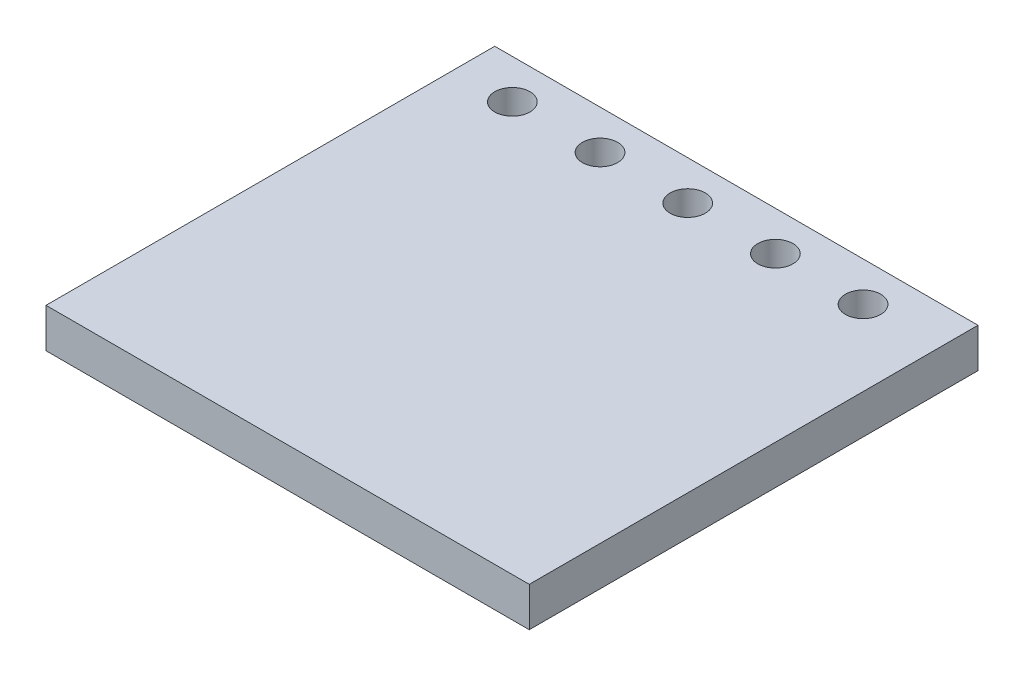
ISO-10303-21;
HEADER;
FILE_DESCRIPTION(('STEP AP214'),'2;1');
FILE_NAME('part.step','',(''),(''),'','','');
FILE_SCHEMA(('AUTOMOTIVE_DESIGN { 1 0 10303 214 1 1 1 1 }'));
ENDSEC;
DATA;
#1=APPLICATION_CONTEXT('core data for automotive mechanical design processes');
#2=APPLICATION_PROTOCOL_DEFINITION('international standard','automotive_design',2000,#1);
#3=PRODUCT_CONTEXT('',#1,'mechanical');
#4=PRODUCT('Part','Part','',(#3));
#5=PRODUCT_RELATED_PRODUCT_CATEGORY('part','',(#4));
#6=PRODUCT_DEFINITION_FORMATION('','',#4);
#7=PRODUCT_DEFINITION_CONTEXT('part definition',#1,'design');
#8=PRODUCT_DEFINITION('design','',#6,#7);
#9=PRODUCT_DEFINITION_SHAPE('','',#8);
#10=(LENGTH_UNIT() NAMED_UNIT(*) SI_UNIT(.MILLI.,.METRE.));
#11=(NAMED_UNIT(*) PLANE_ANGLE_UNIT() SI_UNIT($,.RADIAN.));
#12=(NAMED_UNIT(*) SI_UNIT($,.STERADIAN.) SOLID_ANGLE_UNIT());
#13=UNCERTAINTY_MEASURE_WITH_UNIT(LENGTH_MEASURE(1.E-05),#10,'distance_accuracy_value','');
#14=(GEOMETRIC_REPRESENTATION_CONTEXT(3) GLOBAL_UNCERTAINTY_ASSIGNED_CONTEXT((#13)) GLOBAL_UNIT_ASSIGNED_CONTEXT((#10,
#11,#12)) REPRESENTATION_CONTEXT('',''));
#15=CARTESIAN_POINT('',(0.,0.,0.));
#16=DIRECTION('',(0.,0.,1.));
#17=DIRECTION('',(1.,0.,0.));
#18=AXIS2_PLACEMENT_3D('',#15,#16,#17);
#19=CARTESIAN_POINT('',(0.,1.14,0.));
#20=DIRECTION('',(0.,1.,0.));
#21=DIRECTION('',(0.,0.,1.));
#22=AXIS2_PLACEMENT_3D('',#19,#20,#21);
#23=PLANE('',#22);
#24=CARTESIAN_POINT('',(9.27,1.14,1.14));
#25=DIRECTION('',(0.,1.,0.));
#26=DIRECTION('',(0.,0.,1.));
#27=AXIS2_PLACEMENT_3D('',#24,#25,#26);
#28=CIRCLE('',#27,0.509999999999999);
#29=CARTESIAN_POINT('',(9.27,1.14,1.65));
#30=VERTEX_POINT('',#29);
#31=EDGE_CURVE('E127',#30,#30,#28,.T.);
#32=ORIENTED_EDGE('',*,*,#31,.F.);
#33=EDGE_LOOP('',(#32));
#34=FACE_BOUND('',#33,.T.);
#35=CARTESIAN_POINT('',(4.19,1.14,1.14));
#36=DIRECTION('',(0.,1.,0.));
#37=DIRECTION('',(0.,0.,1.));
#38=AXIS2_PLACEMENT_3D('',#35,#36,#37);
#39=CIRCLE('',#38,0.51);
#40=CARTESIAN_POINT('',(4.19,1.14,1.65));
#41=VERTEX_POINT('',#40);
#42=EDGE_CURVE('E115',#41,#41,#39,.T.);
#43=ORIENTED_EDGE('',*,*,#42,.F.);
#44=EDGE_LOOP('',(#43));
#45=FACE_BOUND('',#44,.T.);
#46=DIRECTION('',(0.,0.,1.));
#47=VECTOR('',#46,1.);
#48=CARTESIAN_POINT('',(0.,1.14,0.));
#49=LINE('',#48,#47);
#50=CARTESIAN_POINT('',(0.,1.14,0.));
#51=VERTEX_POINT('',#50);
#52=CARTESIAN_POINT('',(0.,1.14,13.));
#53=VERTEX_POINT('',#52);
#54=EDGE_CURVE('E85',#51,#53,#49,.T.);
#55=ORIENTED_EDGE('',*,*,#54,.T.);
#56=DIRECTION('',(1.,0.,0.));
#57=VECTOR('',#56,1.);
#58=CARTESIAN_POINT('',(0.,1.14,13.));
#59=LINE('',#58,#57);
#60=CARTESIAN_POINT('',(14.,1.14,13.));
#61=VERTEX_POINT('',#60);
#62=EDGE_CURVE('E80',#53,#61,#59,.T.);
#63=ORIENTED_EDGE('',*,*,#62,.T.);
#64=DIRECTION('',(0.,0.,-1.));
#65=VECTOR('',#64,1.);
#66=CARTESIAN_POINT('',(14.,1.14,0.));
#67=LINE('',#66,#65);
#68=CARTESIAN_POINT('',(14.,1.14,0.));
#69=VERTEX_POINT('',#68);
#70=EDGE_CURVE('E83',#61,#69,#67,.T.);
#71=ORIENTED_EDGE('',*,*,#70,.T.);
#72=DIRECTION('',(-1.,0.,0.));
#73=VECTOR('',#72,1.);
#74=CARTESIAN_POINT('',(0.,1.14,0.));
#75=LINE('',#74,#73);
#76=EDGE_CURVE('E50',#69,#51,#75,.T.);
#77=ORIENTED_EDGE('',*,*,#76,.T.);
#78=EDGE_LOOP('',(#55,#63,#71,#77));
#79=FACE_BOUND('',#78,.T.);
#80=CARTESIAN_POINT('',(1.65,1.14,1.14));
#81=DIRECTION('',(0.,1.,0.));
#82=DIRECTION('',(0.,0.,1.));
#83=AXIS2_PLACEMENT_3D('',#80,#81,#82);
#84=CIRCLE('',#83,0.51);
#85=CARTESIAN_POINT('',(1.65,1.14,1.65));
#86=VERTEX_POINT('',#85);
#87=EDGE_CURVE('E100',#86,#86,#84,.T.);
#88=ORIENTED_EDGE('',*,*,#87,.F.);
#89=EDGE_LOOP('',(#88));
#90=FACE_BOUND('',#89,.T.);
#91=CARTESIAN_POINT('',(6.73,1.14,1.14));
#92=DIRECTION('',(0.,1.,0.));
#93=DIRECTION('',(0.,0.,1.));
#94=AXIS2_PLACEMENT_3D('',#91,#92,#93);
#95=CIRCLE('',#94,0.51);
#96=CARTESIAN_POINT('',(6.73,1.14,1.65));
#97=VERTEX_POINT('',#96);
#98=EDGE_CURVE('E121',#97,#97,#95,.T.);
#99=ORIENTED_EDGE('',*,*,#98,.F.);
#100=EDGE_LOOP('',(#99));
#101=FACE_BOUND('',#100,.T.);
#102=CARTESIAN_POINT('',(11.81,1.14,1.14));
#103=DIRECTION('',(0.,1.,0.));
#104=DIRECTION('',(0.,0.,1.));
#105=AXIS2_PLACEMENT_3D('',#102,#103,#104);
#106=CIRCLE('',#105,0.509999999999999);
#107=CARTESIAN_POINT('',(11.81,1.14,1.65));
#108=VERTEX_POINT('',#107);
#109=EDGE_CURVE('E133',#108,#108,#106,.T.);
#110=ORIENTED_EDGE('',*,*,#109,.F.);
#111=EDGE_LOOP('',(#110));
#112=FACE_BOUND('',#111,.T.);
#113=ADVANCED_FACE('F33',(#34,#45,#79,#90,#101,#112),#23,.T.);
#114=CARTESIAN_POINT('',(0.,0.,0.));
#115=DIRECTION('',(0.,1.,0.));
#116=DIRECTION('',(0.,0.,1.));
#117=AXIS2_PLACEMENT_3D('',#114,#115,#116);
#118=PLANE('',#117);
#119=DIRECTION('',(0.,0.,1.));
#120=VECTOR('',#119,1.);
#121=CARTESIAN_POINT('',(0.,0.,0.));
#122=LINE('',#121,#120);
#123=CARTESIAN_POINT('',(0.,0.,0.));
#124=VERTEX_POINT('',#123);
#125=CARTESIAN_POINT('',(0.,0.,13.));
#126=VERTEX_POINT('',#125);
#127=EDGE_CURVE('E97',#124,#126,#122,.T.);
#128=ORIENTED_EDGE('',*,*,#127,.F.);
#129=DIRECTION('',(-1.,0.,0.));
#130=VECTOR('',#129,1.);
#131=CARTESIAN_POINT('',(0.,0.,0.));
#132=LINE('',#131,#130);
#133=CARTESIAN_POINT('',(14.,0.,0.));
#134=VERTEX_POINT('',#133);
#135=EDGE_CURVE('E73',#134,#124,#132,.T.);
#136=ORIENTED_EDGE('',*,*,#135,.F.);
#137=DIRECTION('',(0.,0.,-1.));
#138=VECTOR('',#137,1.);
#139=CARTESIAN_POINT('',(14.,0.,0.));
#140=LINE('',#139,#138);
#141=CARTESIAN_POINT('',(14.,0.,13.));
#142=VERTEX_POINT('',#141);
#143=EDGE_CURVE('E67',#142,#134,#140,.T.);
#144=ORIENTED_EDGE('',*,*,#143,.F.);
#145=DIRECTION('',(1.,0.,0.));
#146=VECTOR('',#145,1.);
#147=CARTESIAN_POINT('',(0.,0.,13.));
#148=LINE('',#147,#146);
#149=EDGE_CURVE('E89',#126,#142,#148,.T.);
#150=ORIENTED_EDGE('',*,*,#149,.F.);
#151=EDGE_LOOP('',(#128,#136,#144,#150));
#152=FACE_BOUND('',#151,.T.);
#153=CARTESIAN_POINT('',(1.65,0.,1.14));
#154=DIRECTION('',(0.,1.,0.));
#155=DIRECTION('',(0.,0.,1.));
#156=AXIS2_PLACEMENT_3D('',#153,#154,#155);
#157=CIRCLE('',#156,0.51);
#158=CARTESIAN_POINT('',(1.65,0.,1.65));
#159=VERTEX_POINT('',#158);
#160=EDGE_CURVE('E112',#159,#159,#157,.T.);
#161=ORIENTED_EDGE('',*,*,#160,.T.);
#162=EDGE_LOOP('',(#161));
#163=FACE_BOUND('',#162,.T.);
#164=CARTESIAN_POINT('',(4.19,0.,1.14));
#165=DIRECTION('',(0.,1.,0.));
#166=DIRECTION('',(0.,0.,1.));
#167=AXIS2_PLACEMENT_3D('',#164,#165,#166);
#168=CIRCLE('',#167,0.51);
#169=CARTESIAN_POINT('',(4.19,0.,1.65));
#170=VERTEX_POINT('',#169);
#171=EDGE_CURVE('E118',#170,#170,#168,.T.);
#172=ORIENTED_EDGE('',*,*,#171,.T.);
#173=EDGE_LOOP('',(#172));
#174=FACE_BOUND('',#173,.T.);
#175=CARTESIAN_POINT('',(6.73,0.,1.14));
#176=DIRECTION('',(0.,1.,0.));
#177=DIRECTION('',(0.,0.,1.));
#178=AXIS2_PLACEMENT_3D('',#175,#176,#177);
#179=CIRCLE('',#178,0.51);
#180=CARTESIAN_POINT('',(6.73,0.,1.65));
#181=VERTEX_POINT('',#180);
#182=EDGE_CURVE('E124',#181,#181,#179,.T.);
#183=ORIENTED_EDGE('',*,*,#182,.T.);
#184=EDGE_LOOP('',(#183));
#185=FACE_BOUND('',#184,.T.);
#186=CARTESIAN_POINT('',(9.27,0.,1.14));
#187=DIRECTION('',(0.,1.,0.));
#188=DIRECTION('',(0.,0.,1.));
#189=AXIS2_PLACEMENT_3D('',#186,#187,#188);
#190=CIRCLE('',#189,0.509999999999999);
#191=CARTESIAN_POINT('',(9.27,0.,1.65));
#192=VERTEX_POINT('',#191);
#193=EDGE_CURVE('E130',#192,#192,#190,.T.);
#194=ORIENTED_EDGE('',*,*,#193,.T.);
#195=EDGE_LOOP('',(#194));
#196=FACE_BOUND('',#195,.T.);
#197=CARTESIAN_POINT('',(11.81,0.,1.14));
#198=DIRECTION('',(0.,1.,0.));
#199=DIRECTION('',(0.,0.,1.));
#200=AXIS2_PLACEMENT_3D('',#197,#198,#199);
#201=CIRCLE('',#200,0.509999999999999);
#202=CARTESIAN_POINT('',(11.81,0.,1.65));
#203=VERTEX_POINT('',#202);
#204=EDGE_CURVE('E136',#203,#203,#201,.T.);
#205=ORIENTED_EDGE('',*,*,#204,.T.);
#206=EDGE_LOOP('',(#205));
#207=FACE_BOUND('',#206,.T.);
#208=ADVANCED_FACE('F108',(#152,#163,#174,#185,#196,#207),#118,.F.);
#209=CARTESIAN_POINT('',(0.,1.14,0.));
#210=DIRECTION('',(1.,0.,0.));
#211=DIRECTION('',(0.,0.,-1.));
#212=AXIS2_PLACEMENT_3D('',#209,#210,#211);
#213=PLANE('',#212);
#214=ORIENTED_EDGE('',*,*,#127,.T.);
#215=DIRECTION('',(0.,-1.,0.));
#216=VECTOR('',#215,1.);
#217=CARTESIAN_POINT('',(0.,1.14,13.));
#218=LINE('',#217,#216);
#219=EDGE_CURVE('E11',#53,#126,#218,.T.);
#220=ORIENTED_EDGE('',*,*,#219,.F.);
#221=ORIENTED_EDGE('',*,*,#54,.F.);
#222=DIRECTION('',(0.,-1.,0.));
#223=VECTOR('',#222,1.);
#224=CARTESIAN_POINT('',(0.,1.14,0.));
#225=LINE('',#224,#223);
#226=EDGE_CURVE('E93',#51,#124,#225,.T.);
#227=ORIENTED_EDGE('',*,*,#226,.T.);
#228=EDGE_LOOP('',(#214,#220,#221,#227));
#229=FACE_BOUND('',#228,.T.);
#230=ADVANCED_FACE('F35',(#229),#213,.F.);
#231=CARTESIAN_POINT('',(0.,1.14,13.));
#232=DIRECTION('',(0.,0.,-1.));
#233=DIRECTION('',(-1.,0.,0.));
#234=AXIS2_PLACEMENT_3D('',#231,#232,#233);
#235=PLANE('',#234);
#236=ORIENTED_EDGE('',*,*,#149,.T.);
#237=DIRECTION('',(0.,-1.,0.));
#238=VECTOR('',#237,1.);
#239=CARTESIAN_POINT('',(14.,1.14,13.));
#240=LINE('',#239,#238);
#241=EDGE_CURVE('E42',#61,#142,#240,.T.);
#242=ORIENTED_EDGE('',*,*,#241,.F.);
#243=ORIENTED_EDGE('',*,*,#62,.F.);
#244=ORIENTED_EDGE('',*,*,#219,.T.);
#245=EDGE_LOOP('',(#236,#242,#243,#244));
#246=FACE_BOUND('',#245,.T.);
#247=ADVANCED_FACE('F88',(#246),#235,.F.);
#248=CARTESIAN_POINT('',(14.,1.14,0.));
#249=DIRECTION('',(-1.,0.,0.));
#250=DIRECTION('',(0.,0.,1.));
#251=AXIS2_PLACEMENT_3D('',#248,#249,#250);
#252=PLANE('',#251);
#253=ORIENTED_EDGE('',*,*,#143,.T.);
#254=DIRECTION('',(0.,-1.,0.));
#255=VECTOR('',#254,1.);
#256=CARTESIAN_POINT('',(14.,1.14,0.));
#257=LINE('',#256,#255);
#258=EDGE_CURVE('E90',#69,#134,#257,.T.);
#259=ORIENTED_EDGE('',*,*,#258,.F.);
#260=ORIENTED_EDGE('',*,*,#70,.F.);
#261=ORIENTED_EDGE('',*,*,#241,.T.);
#262=EDGE_LOOP('',(#253,#259,#260,#261));
#263=FACE_BOUND('',#262,.T.);
#264=ADVANCED_FACE('F91',(#263),#252,.F.);
#265=CARTESIAN_POINT('',(0.,1.14,0.));
#266=DIRECTION('',(0.,0.,1.));
#267=DIRECTION('',(1.,0.,0.));
#268=AXIS2_PLACEMENT_3D('',#265,#266,#267);
#269=PLANE('',#268);
#270=ORIENTED_EDGE('',*,*,#135,.T.);
#271=ORIENTED_EDGE('',*,*,#226,.F.);
#272=ORIENTED_EDGE('',*,*,#76,.F.);
#273=ORIENTED_EDGE('',*,*,#258,.T.);
#274=EDGE_LOOP('',(#270,#271,#272,#273));
#275=FACE_BOUND('',#274,.T.);
#276=ADVANCED_FACE('F105',(#275),#269,.F.);
#277=CARTESIAN_POINT('',(1.65,1.14,1.14));
#278=DIRECTION('',(0.,-1.,0.));
#279=DIRECTION('',(0.,0.,-1.));
#280=AXIS2_PLACEMENT_3D('',#277,#278,#279);
#281=CYLINDRICAL_SURFACE('',#280,0.51);
#282=ORIENTED_EDGE('',*,*,#87,.T.);
#283=EDGE_LOOP('',(#282));
#284=FACE_BOUND('',#283,.T.);
#285=ORIENTED_EDGE('',*,*,#160,.F.);
#286=EDGE_LOOP('',(#285));
#287=FACE_BOUND('',#286,.T.);
#288=ADVANCED_FACE('F155',(#284,#287),#281,.F.);
#289=CARTESIAN_POINT('',(4.19,1.14,1.14));
#290=DIRECTION('',(0.,-1.,0.));
#291=DIRECTION('',(0.,0.,-1.));
#292=AXIS2_PLACEMENT_3D('',#289,#290,#291);
#293=CYLINDRICAL_SURFACE('',#292,0.51);
#294=ORIENTED_EDGE('',*,*,#42,.T.);
#295=EDGE_LOOP('',(#294));
#296=FACE_BOUND('',#295,.T.);
#297=ORIENTED_EDGE('',*,*,#171,.F.);
#298=EDGE_LOOP('',(#297));
#299=FACE_BOUND('',#298,.T.);
#300=ADVANCED_FACE('F201',(#296,#299),#293,.F.);
#301=CARTESIAN_POINT('',(6.73,1.14,1.14));
#302=DIRECTION('',(0.,-1.,0.));
#303=DIRECTION('',(0.,0.,-1.));
#304=AXIS2_PLACEMENT_3D('',#301,#302,#303);
#305=CYLINDRICAL_SURFACE('',#304,0.51);
#306=ORIENTED_EDGE('',*,*,#98,.T.);
#307=EDGE_LOOP('',(#306));
#308=FACE_BOUND('',#307,.T.);
#309=ORIENTED_EDGE('',*,*,#182,.F.);
#310=EDGE_LOOP('',(#309));
#311=FACE_BOUND('',#310,.T.);
#312=ADVANCED_FACE('F209',(#308,#311),#305,.F.);
#313=CARTESIAN_POINT('',(9.27,1.14,1.14));
#314=DIRECTION('',(0.,-1.,0.));
#315=DIRECTION('',(0.,0.,-1.));
#316=AXIS2_PLACEMENT_3D('',#313,#314,#315);
#317=CYLINDRICAL_SURFACE('',#316,0.509999999999999);
#318=ORIENTED_EDGE('',*,*,#31,.T.);
#319=EDGE_LOOP('',(#318));
#320=FACE_BOUND('',#319,.T.);
#321=ORIENTED_EDGE('',*,*,#193,.F.);
#322=EDGE_LOOP('',(#321));
#323=FACE_BOUND('',#322,.T.);
#324=ADVANCED_FACE('F217',(#320,#323),#317,.F.);
#325=CARTESIAN_POINT('',(11.81,1.14,1.14));
#326=DIRECTION('',(0.,-1.,0.));
#327=DIRECTION('',(0.,0.,-1.));
#328=AXIS2_PLACEMENT_3D('',#325,#326,#327);
#329=CYLINDRICAL_SURFACE('',#328,0.509999999999999);
#330=ORIENTED_EDGE('',*,*,#109,.T.);
#331=EDGE_LOOP('',(#330));
#332=FACE_BOUND('',#331,.T.);
#333=ORIENTED_EDGE('',*,*,#204,.F.);
#334=EDGE_LOOP('',(#333));
#335=FACE_BOUND('',#334,.T.);
#336=ADVANCED_FACE('F142',(#332,#335),#329,.F.);
#337=CLOSED_SHELL('',(#113,#208,#230,#247,#264,#276,#288,#300,#312,#324,#336));
#338=MANIFOLD_SOLID_BREP('B2',#337);
#339=ADVANCED_BREP_SHAPE_REPRESENTATION('',(#18,#338),#14);
#340=SHAPE_DEFINITION_REPRESENTATION(#9,#339);
ENDSEC;
END-ISO-10303-21;
